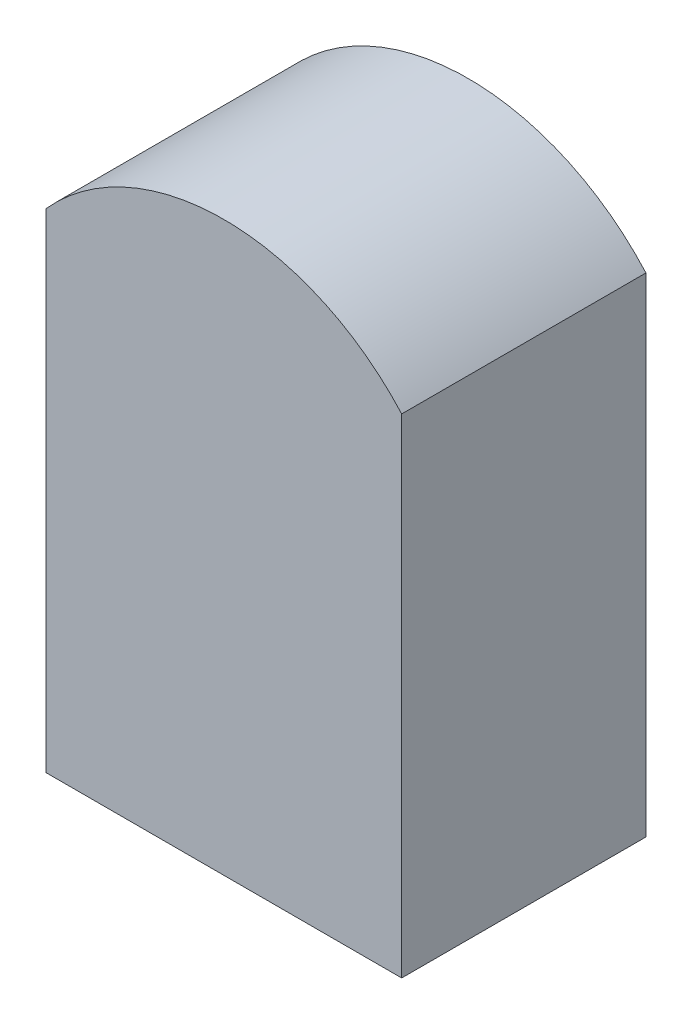
ISO-10303-21;
HEADER;
FILE_DESCRIPTION(('STEP AP214'),'2;1');
FILE_NAME('part.step','',(''),(''),'','','');
FILE_SCHEMA(('AUTOMOTIVE_DESIGN { 1 0 10303 214 1 1 1 1 }'));
ENDSEC;
DATA;
#1=APPLICATION_CONTEXT('core data for automotive mechanical design processes');
#2=APPLICATION_PROTOCOL_DEFINITION('international standard','automotive_design',2000,#1);
#3=PRODUCT_CONTEXT('',#1,'mechanical');
#4=PRODUCT('Part','Part','',(#3));
#5=PRODUCT_RELATED_PRODUCT_CATEGORY('part','',(#4));
#6=PRODUCT_DEFINITION_FORMATION('','',#4);
#7=PRODUCT_DEFINITION_CONTEXT('part definition',#1,'design');
#8=PRODUCT_DEFINITION('design','',#6,#7);
#9=PRODUCT_DEFINITION_SHAPE('','',#8);
#10=(LENGTH_UNIT() NAMED_UNIT(*) SI_UNIT(.MILLI.,.METRE.));
#11=(NAMED_UNIT(*) PLANE_ANGLE_UNIT() SI_UNIT($,.RADIAN.));
#12=(NAMED_UNIT(*) SI_UNIT($,.STERADIAN.) SOLID_ANGLE_UNIT());
#13=UNCERTAINTY_MEASURE_WITH_UNIT(LENGTH_MEASURE(1.E-05),#10,'distance_accuracy_value','');
#14=(GEOMETRIC_REPRESENTATION_CONTEXT(3) GLOBAL_UNCERTAINTY_ASSIGNED_CONTEXT((#13)) GLOBAL_UNIT_ASSIGNED_CONTEXT((#10,
#11,#12)) REPRESENTATION_CONTEXT('',''));
#15=CARTESIAN_POINT('',(0.,0.,0.));
#16=DIRECTION('',(0.,0.,1.));
#17=DIRECTION('',(1.,0.,0.));
#18=AXIS2_PLACEMENT_3D('',#15,#16,#17);
#19=CARTESIAN_POINT('',(2.5542386265407,4.22265882760225,3.5));
#20=DIRECTION('',(0.,0.,-1.));
#21=DIRECTION('',(-1.,0.,0.));
#22=AXIS2_PLACEMENT_3D('',#19,#20,#21);
#23=CYLINDRICAL_SURFACE('',#22,3.41738286665648);
#24=CARTESIAN_POINT('',(2.5542386265407,4.22265882760225,0.));
#25=DIRECTION('',(0.,0.,1.));
#26=DIRECTION('',(1.,0.,0.));
#27=AXIS2_PLACEMENT_3D('',#24,#25,#26);
#28=CIRCLE('',#27,3.41738286665648);
#29=CARTESIAN_POINT('',(0.00625455245010039,6.5,0.));
#30=VERTEX_POINT('',#29);
#31=CARTESIAN_POINT('',(5.1022227006313,6.5,0.));
#32=VERTEX_POINT('',#31);
#33=EDGE_CURVE('E115',#30,#32,#28,.F.);
#34=ORIENTED_EDGE('',*,*,#33,.F.);
#35=DIRECTION('',(0.,0.,-1.));
#36=VECTOR('',#35,1.);
#37=CARTESIAN_POINT('',(0.00625455245010039,6.5,3.5));
#38=LINE('',#37,#36);
#39=CARTESIAN_POINT('',(0.00625455245010039,6.5,3.5));
#40=VERTEX_POINT('',#39);
#41=EDGE_CURVE('E11',#40,#30,#38,.T.);
#42=ORIENTED_EDGE('',*,*,#41,.F.);
#43=CARTESIAN_POINT('',(2.5542386265407,4.22265882760225,3.5));
#44=DIRECTION('',(0.,0.,1.));
#45=DIRECTION('',(1.,0.,0.));
#46=AXIS2_PLACEMENT_3D('',#43,#44,#45);
#47=CIRCLE('',#46,3.41738286665648);
#48=CARTESIAN_POINT('',(5.1022227006313,6.5,3.5));
#49=VERTEX_POINT('',#48);
#50=EDGE_CURVE('E96',#40,#49,#47,.F.);
#51=ORIENTED_EDGE('',*,*,#50,.T.);
#52=DIRECTION('',(0.,0.,-1.));
#53=VECTOR('',#52,1.);
#54=CARTESIAN_POINT('',(5.1022227006313,6.5,3.5));
#55=LINE('',#54,#53);
#56=EDGE_CURVE('E64',#49,#32,#55,.T.);
#57=ORIENTED_EDGE('',*,*,#56,.T.);
#58=EDGE_LOOP('',(#34,#42,#51,#57));
#59=FACE_BOUND('',#58,.T.);
#60=ADVANCED_FACE('F47',(#59),#23,.T.);
#61=CARTESIAN_POINT('',(0.00625455245010118,0.,3.5));
#62=DIRECTION('',(1.,0.,0.));
#63=DIRECTION('',(0.,1.,0.));
#64=AXIS2_PLACEMENT_3D('',#61,#62,#63);
#65=PLANE('',#64);
#66=DIRECTION('',(0.,-1.,0.));
#67=VECTOR('',#66,1.);
#68=CARTESIAN_POINT('',(0.00625455245010118,0.,0.));
#69=LINE('',#68,#67);
#70=CARTESIAN_POINT('',(0.00625455245010124,-0.5,0.));
#71=VERTEX_POINT('',#70);
#72=EDGE_CURVE('E103',#30,#71,#69,.T.);
#73=ORIENTED_EDGE('',*,*,#72,.T.);
#74=DIRECTION('',(0.,0.,-1.));
#75=VECTOR('',#74,1.);
#76=CARTESIAN_POINT('',(0.00625455245010124,-0.5,3.5));
#77=LINE('',#76,#75);
#78=CARTESIAN_POINT('',(0.00625455245010124,-0.5,3.5));
#79=VERTEX_POINT('',#78);
#80=EDGE_CURVE('E56',#79,#71,#77,.T.);
#81=ORIENTED_EDGE('',*,*,#80,.F.);
#82=DIRECTION('',(0.,-1.,0.));
#83=VECTOR('',#82,1.);
#84=CARTESIAN_POINT('',(0.00625455245010118,0.,3.5));
#85=LINE('',#84,#83);
#86=EDGE_CURVE('E90',#40,#79,#85,.T.);
#87=ORIENTED_EDGE('',*,*,#86,.F.);
#88=ORIENTED_EDGE('',*,*,#41,.T.);
#89=EDGE_LOOP('',(#73,#81,#87,#88));
#90=FACE_BOUND('',#89,.T.);
#91=ADVANCED_FACE('F101',(#90),#65,.F.);
#92=CARTESIAN_POINT('',(0.,-0.5,3.5));
#93=DIRECTION('',(0.,1.,0.));
#94=DIRECTION('',(0.,0.,1.));
#95=AXIS2_PLACEMENT_3D('',#92,#93,#94);
#96=PLANE('',#95);
#97=DIRECTION('',(1.,0.,0.));
#98=VECTOR('',#97,1.);
#99=CARTESIAN_POINT('',(0.,-0.5,0.));
#100=LINE('',#99,#98);
#101=CARTESIAN_POINT('',(5.1022227006313,-0.5,0.));
#102=VERTEX_POINT('',#101);
#103=EDGE_CURVE('E120',#71,#102,#100,.T.);
#104=ORIENTED_EDGE('',*,*,#103,.T.);
#105=DIRECTION('',(0.,0.,-1.));
#106=VECTOR('',#105,1.);
#107=CARTESIAN_POINT('',(5.1022227006313,-0.5,3.5));
#108=LINE('',#107,#106);
#109=CARTESIAN_POINT('',(5.1022227006313,-0.5,3.5));
#110=VERTEX_POINT('',#109);
#111=EDGE_CURVE('E78',#110,#102,#108,.T.);
#112=ORIENTED_EDGE('',*,*,#111,.F.);
#113=DIRECTION('',(1.,0.,0.));
#114=VECTOR('',#113,1.);
#115=CARTESIAN_POINT('',(0.,-0.5,3.5));
#116=LINE('',#115,#114);
#117=EDGE_CURVE('E95',#79,#110,#116,.T.);
#118=ORIENTED_EDGE('',*,*,#117,.F.);
#119=ORIENTED_EDGE('',*,*,#80,.T.);
#120=EDGE_LOOP('',(#104,#112,#118,#119));
#121=FACE_BOUND('',#120,.T.);
#122=ADVANCED_FACE('F107',(#121),#96,.F.);
#123=CARTESIAN_POINT('',(5.1022227006313,0.,3.5));
#124=DIRECTION('',(1.,0.,0.));
#125=DIRECTION('',(0.,1.,0.));
#126=AXIS2_PLACEMENT_3D('',#123,#124,#125);
#127=PLANE('',#126);
#128=DIRECTION('',(0.,-1.,0.));
#129=VECTOR('',#128,1.);
#130=CARTESIAN_POINT('',(5.1022227006313,0.,0.));
#131=LINE('',#130,#129);
#132=EDGE_CURVE('E123',#32,#102,#131,.T.);
#133=ORIENTED_EDGE('',*,*,#132,.F.);
#134=ORIENTED_EDGE('',*,*,#56,.F.);
#135=DIRECTION('',(0.,-1.,0.));
#136=VECTOR('',#135,1.);
#137=CARTESIAN_POINT('',(5.1022227006313,0.,3.5));
#138=LINE('',#137,#136);
#139=EDGE_CURVE('E109',#49,#110,#138,.T.);
#140=ORIENTED_EDGE('',*,*,#139,.T.);
#141=ORIENTED_EDGE('',*,*,#111,.T.);
#142=EDGE_LOOP('',(#133,#134,#140,#141));
#143=FACE_BOUND('',#142,.T.);
#144=ADVANCED_FACE('F132',(#143),#127,.T.);
#145=CARTESIAN_POINT('',(0.,0.,3.5));
#146=DIRECTION('',(0.,0.,1.));
#147=DIRECTION('',(1.,0.,0.));
#148=AXIS2_PLACEMENT_3D('',#145,#146,#147);
#149=PLANE('',#148);
#150=ORIENTED_EDGE('',*,*,#50,.F.);
#151=ORIENTED_EDGE('',*,*,#86,.T.);
#152=ORIENTED_EDGE('',*,*,#117,.T.);
#153=ORIENTED_EDGE('',*,*,#139,.F.);
#154=EDGE_LOOP('',(#150,#151,#152,#153));
#155=FACE_BOUND('',#154,.T.);
#156=ADVANCED_FACE('F92',(#155),#149,.T.);
#157=CARTESIAN_POINT('',(0.,0.,0.));
#158=DIRECTION('',(0.,0.,1.));
#159=DIRECTION('',(1.,0.,0.));
#160=AXIS2_PLACEMENT_3D('',#157,#158,#159);
#161=PLANE('',#160);
#162=ORIENTED_EDGE('',*,*,#33,.T.);
#163=ORIENTED_EDGE('',*,*,#132,.T.);
#164=ORIENTED_EDGE('',*,*,#103,.F.);
#165=ORIENTED_EDGE('',*,*,#72,.F.);
#166=EDGE_LOOP('',(#162,#163,#164,#165));
#167=FACE_BOUND('',#166,.T.);
#168=ADVANCED_FACE('F139',(#167),#161,.F.);
#169=CLOSED_SHELL('',(#60,#91,#122,#144,#156,#168));
#170=MANIFOLD_SOLID_BREP('B2',#169);
#171=ADVANCED_BREP_SHAPE_REPRESENTATION('',(#18,#170),#14);
#172=SHAPE_DEFINITION_REPRESENTATION(#9,#171);
ENDSEC;
END-ISO-10303-21;
